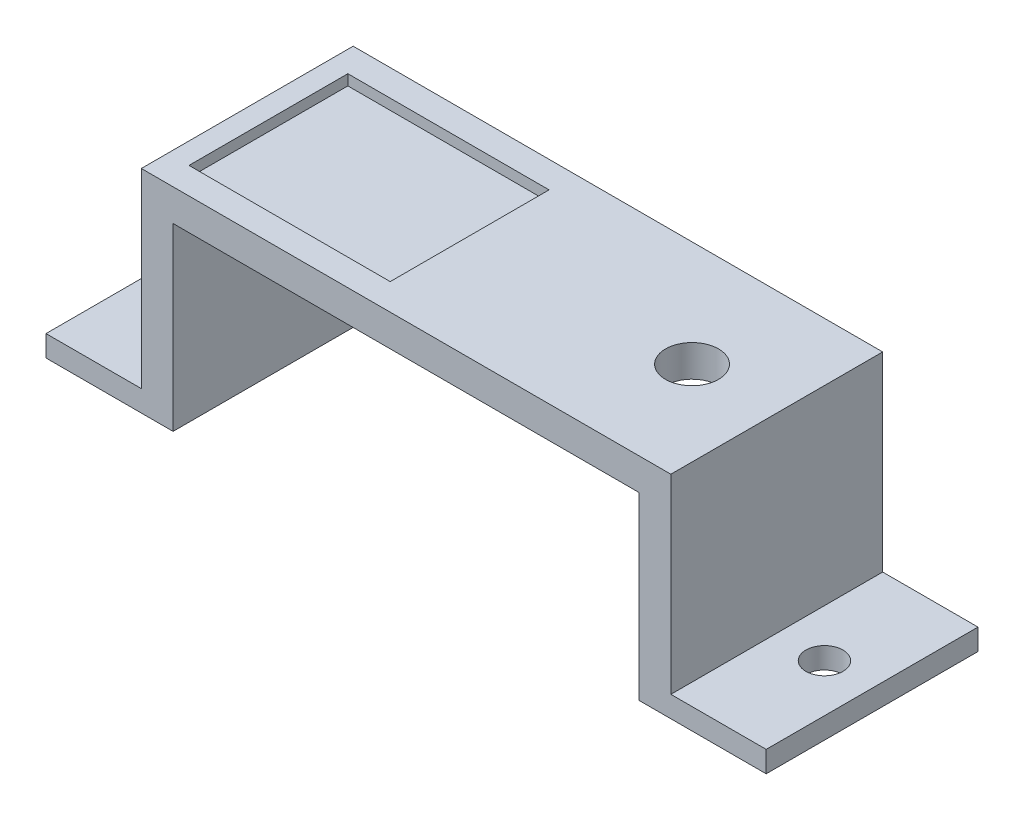
ISO-10303-21;
HEADER;
FILE_DESCRIPTION(('STEP AP214'),'2;1');
FILE_NAME('part.step','',(''),(''),'','','');
FILE_SCHEMA(('AUTOMOTIVE_DESIGN { 1 0 10303 214 1 1 1 1 }'));
ENDSEC;
DATA;
#1=APPLICATION_CONTEXT('core data for automotive mechanical design processes');
#2=APPLICATION_PROTOCOL_DEFINITION('international standard','automotive_design',2000,#1);
#3=PRODUCT_CONTEXT('',#1,'mechanical');
#4=PRODUCT('Part','Part','',(#3));
#5=PRODUCT_RELATED_PRODUCT_CATEGORY('part','',(#4));
#6=PRODUCT_DEFINITION_FORMATION('','',#4);
#7=PRODUCT_DEFINITION_CONTEXT('part definition',#1,'design');
#8=PRODUCT_DEFINITION('design','',#6,#7);
#9=PRODUCT_DEFINITION_SHAPE('','',#8);
#10=(LENGTH_UNIT() NAMED_UNIT(*) SI_UNIT(.MILLI.,.METRE.));
#11=(NAMED_UNIT(*) PLANE_ANGLE_UNIT() SI_UNIT($,.RADIAN.));
#12=(NAMED_UNIT(*) SI_UNIT($,.STERADIAN.) SOLID_ANGLE_UNIT());
#13=UNCERTAINTY_MEASURE_WITH_UNIT(LENGTH_MEASURE(1.E-05),#10,'distance_accuracy_value','');
#14=(GEOMETRIC_REPRESENTATION_CONTEXT(3) GLOBAL_UNCERTAINTY_ASSIGNED_CONTEXT((#13)) GLOBAL_UNIT_ASSIGNED_CONTEXT((#10,
#11,#12)) REPRESENTATION_CONTEXT('',''));
#15=CARTESIAN_POINT('',(0.,0.,0.));
#16=DIRECTION('',(0.,0.,1.));
#17=DIRECTION('',(1.,0.,0.));
#18=AXIS2_PLACEMENT_3D('',#15,#16,#17);
#19=CARTESIAN_POINT('',(-22.,0.,20.));
#20=DIRECTION('',(-1.,0.,0.));
#21=DIRECTION('',(0.,0.,1.));
#22=AXIS2_PLACEMENT_3D('',#19,#20,#21);
#23=PLANE('',#22);
#24=DIRECTION('',(0.,1.,0.));
#25=VECTOR('',#24,1.);
#26=CARTESIAN_POINT('',(-22.,0.,0.));
#27=LINE('',#26,#25);
#28=CARTESIAN_POINT('',(-22.,0.,0.));
#29=VERTEX_POINT('',#28);
#30=CARTESIAN_POINT('',(-22.,17.,0.));
#31=VERTEX_POINT('',#30);
#32=EDGE_CURVE('E228',#29,#31,#27,.T.);
#33=ORIENTED_EDGE('',*,*,#32,.T.);
#34=DIRECTION('',(0.,0.,-1.));
#35=VECTOR('',#34,1.);
#36=CARTESIAN_POINT('',(-22.,17.,20.));
#37=LINE('',#36,#35);
#38=CARTESIAN_POINT('',(-22.,17.,20.));
#39=VERTEX_POINT('',#38);
#40=EDGE_CURVE('E11',#39,#31,#37,.T.);
#41=ORIENTED_EDGE('',*,*,#40,.F.);
#42=DIRECTION('',(0.,1.,0.));
#43=VECTOR('',#42,1.);
#44=CARTESIAN_POINT('',(-22.,0.,20.));
#45=LINE('',#44,#43);
#46=CARTESIAN_POINT('',(-22.,0.,20.));
#47=VERTEX_POINT('',#46);
#48=EDGE_CURVE('E235',#47,#39,#45,.T.);
#49=ORIENTED_EDGE('',*,*,#48,.F.);
#50=DIRECTION('',(0.,0.,-1.));
#51=VECTOR('',#50,1.);
#52=CARTESIAN_POINT('',(-22.,0.,20.));
#53=LINE('',#52,#51);
#54=EDGE_CURVE('E254',#47,#29,#53,.T.);
#55=ORIENTED_EDGE('',*,*,#54,.T.);
#56=EDGE_LOOP('',(#33,#41,#49,#55));
#57=FACE_BOUND('',#56,.T.);
#58=ADVANCED_FACE('F33',(#57),#23,.F.);
#59=CARTESIAN_POINT('',(22.,17.,20.));
#60=DIRECTION('',(0.,1.,0.));
#61=DIRECTION('',(-1.,0.,0.));
#62=AXIS2_PLACEMENT_3D('',#59,#60,#61);
#63=PLANE('',#62);
#64=CARTESIAN_POINT('',(17.,17.,10.));
#65=DIRECTION('',(0.,1.,0.));
#66=DIRECTION('',(-1.,0.,0.));
#67=AXIS2_PLACEMENT_3D('',#64,#65,#66);
#68=CIRCLE('',#67,2.5);
#69=CARTESIAN_POINT('',(14.5,17.,10.));
#70=VERTEX_POINT('',#69);
#71=EDGE_CURVE('E199',#70,#70,#68,.T.);
#72=ORIENTED_EDGE('',*,*,#71,.T.);
#73=EDGE_LOOP('',(#72));
#74=FACE_BOUND('',#73,.T.);
#75=DIRECTION('',(1.,0.,0.));
#76=VECTOR('',#75,1.);
#77=CARTESIAN_POINT('',(22.,17.,0.));
#78=LINE('',#77,#76);
#79=CARTESIAN_POINT('',(22.,17.,0.));
#80=VERTEX_POINT('',#79);
#81=EDGE_CURVE('E257',#31,#80,#78,.T.);
#82=ORIENTED_EDGE('',*,*,#81,.T.);
#83=DIRECTION('',(0.,0.,-1.));
#84=VECTOR('',#83,1.);
#85=CARTESIAN_POINT('',(22.,17.,20.));
#86=LINE('',#85,#84);
#87=CARTESIAN_POINT('',(22.,17.,20.));
#88=VERTEX_POINT('',#87);
#89=EDGE_CURVE('E41',#88,#80,#86,.T.);
#90=ORIENTED_EDGE('',*,*,#89,.F.);
#91=DIRECTION('',(1.,0.,0.));
#92=VECTOR('',#91,1.);
#93=CARTESIAN_POINT('',(22.,17.,20.));
#94=LINE('',#93,#92);
#95=EDGE_CURVE('E238',#39,#88,#94,.T.);
#96=ORIENTED_EDGE('',*,*,#95,.F.);
#97=ORIENTED_EDGE('',*,*,#40,.T.);
#98=EDGE_LOOP('',(#82,#90,#96,#97));
#99=FACE_BOUND('',#98,.T.);
#100=ADVANCED_FACE('F312',(#74,#99),#63,.F.);
#101=CARTESIAN_POINT('',(22.,0.,20.));
#102=DIRECTION('',(1.,0.,0.));
#103=DIRECTION('',(0.,0.,-1.));
#104=AXIS2_PLACEMENT_3D('',#101,#102,#103);
#105=PLANE('',#104);
#106=DIRECTION('',(0.,-1.,0.));
#107=VECTOR('',#106,1.);
#108=CARTESIAN_POINT('',(22.,0.,0.));
#109=LINE('',#108,#107);
#110=CARTESIAN_POINT('',(22.,0.,0.));
#111=VERTEX_POINT('',#110);
#112=EDGE_CURVE('E259',#80,#111,#109,.T.);
#113=ORIENTED_EDGE('',*,*,#112,.T.);
#114=DIRECTION('',(0.,0.,-1.));
#115=VECTOR('',#114,1.);
#116=CARTESIAN_POINT('',(22.,0.,20.));
#117=LINE('',#116,#115);
#118=CARTESIAN_POINT('',(22.,0.,20.));
#119=VERTEX_POINT('',#118);
#120=EDGE_CURVE('E278',#119,#111,#117,.T.);
#121=ORIENTED_EDGE('',*,*,#120,.F.);
#122=DIRECTION('',(0.,-1.,0.));
#123=VECTOR('',#122,1.);
#124=CARTESIAN_POINT('',(22.,0.,20.));
#125=LINE('',#124,#123);
#126=EDGE_CURVE('E241',#88,#119,#125,.T.);
#127=ORIENTED_EDGE('',*,*,#126,.F.);
#128=ORIENTED_EDGE('',*,*,#89,.T.);
#129=EDGE_LOOP('',(#113,#121,#127,#128));
#130=FACE_BOUND('',#129,.T.);
#131=ADVANCED_FACE('F303',(#130),#105,.F.);
#132=CARTESIAN_POINT('',(22.,0.,20.));
#133=DIRECTION('',(0.,1.,0.));
#134=DIRECTION('',(-1.,0.,0.));
#135=AXIS2_PLACEMENT_3D('',#132,#133,#134);
#136=PLANE('',#135);
#137=CARTESIAN_POINT('',(29.5,0.,10.));
#138=DIRECTION('',(0.,-1.,0.));
#139=DIRECTION('',(1.,0.,0.));
#140=AXIS2_PLACEMENT_3D('',#137,#138,#139);
#141=CIRCLE('',#140,1.75);
#142=CARTESIAN_POINT('',(31.25,0.,10.));
#143=VERTEX_POINT('',#142);
#144=EDGE_CURVE('E289',#143,#143,#141,.T.);
#145=ORIENTED_EDGE('',*,*,#144,.F.);
#146=EDGE_LOOP('',(#145));
#147=FACE_BOUND('',#146,.T.);
#148=DIRECTION('',(1.,0.,0.));
#149=VECTOR('',#148,1.);
#150=CARTESIAN_POINT('',(22.,0.,0.));
#151=LINE('',#150,#149);
#152=CARTESIAN_POINT('',(34.,0.,0.));
#153=VERTEX_POINT('',#152);
#154=EDGE_CURVE('E261',#111,#153,#151,.T.);
#155=ORIENTED_EDGE('',*,*,#154,.T.);
#156=DIRECTION('',(0.,0.,1.));
#157=VECTOR('',#156,1.);
#158=CARTESIAN_POINT('',(34.,0.,0.));
#159=LINE('',#158,#157);
#160=CARTESIAN_POINT('',(34.,0.,20.));
#161=VERTEX_POINT('',#160);
#162=EDGE_CURVE('E156',#153,#161,#159,.T.);
#163=ORIENTED_EDGE('',*,*,#162,.T.);
#164=DIRECTION('',(1.,0.,0.));
#165=VECTOR('',#164,1.);
#166=CARTESIAN_POINT('',(22.,0.,20.));
#167=LINE('',#166,#165);
#168=EDGE_CURVE('E243',#119,#161,#167,.T.);
#169=ORIENTED_EDGE('',*,*,#168,.F.);
#170=ORIENTED_EDGE('',*,*,#120,.T.);
#171=EDGE_LOOP('',(#155,#163,#169,#170));
#172=FACE_BOUND('',#171,.T.);
#173=ADVANCED_FACE('F299',(#147,#172),#136,.F.);
#174=CARTESIAN_POINT('',(25.,0.,20.));
#175=DIRECTION('',(-1.,0.,0.));
#176=DIRECTION('',(0.,-1.,0.));
#177=AXIS2_PLACEMENT_3D('',#174,#175,#176);
#178=PLANE('',#177);
#179=DIRECTION('',(0.,1.,0.));
#180=VECTOR('',#179,1.);
#181=CARTESIAN_POINT('',(25.,0.,20.));
#182=LINE('',#181,#180);
#183=CARTESIAN_POINT('',(25.,2.,20.));
#184=VERTEX_POINT('',#183);
#185=CARTESIAN_POINT('',(25.,20.,20.));
#186=VERTEX_POINT('',#185);
#187=EDGE_CURVE('E245',#184,#186,#182,.T.);
#188=ORIENTED_EDGE('',*,*,#187,.F.);
#189=DIRECTION('',(0.,0.,-1.));
#190=VECTOR('',#189,1.);
#191=CARTESIAN_POINT('',(25.,2.,0.));
#192=LINE('',#191,#190);
#193=CARTESIAN_POINT('',(25.,2.,0.));
#194=VERTEX_POINT('',#193);
#195=EDGE_CURVE('E170',#184,#194,#192,.T.);
#196=ORIENTED_EDGE('',*,*,#195,.T.);
#197=DIRECTION('',(0.,1.,0.));
#198=VECTOR('',#197,1.);
#199=CARTESIAN_POINT('',(25.,0.,0.));
#200=LINE('',#199,#198);
#201=CARTESIAN_POINT('',(25.,20.,0.));
#202=VERTEX_POINT('',#201);
#203=EDGE_CURVE('E169',#194,#202,#200,.T.);
#204=ORIENTED_EDGE('',*,*,#203,.T.);
#205=DIRECTION('',(0.,0.,-1.));
#206=VECTOR('',#205,1.);
#207=CARTESIAN_POINT('',(25.,20.,20.));
#208=LINE('',#207,#206);
#209=EDGE_CURVE('E275',#186,#202,#208,.T.);
#210=ORIENTED_EDGE('',*,*,#209,.F.);
#211=EDGE_LOOP('',(#188,#196,#204,#210));
#212=FACE_BOUND('',#211,.T.);
#213=ADVANCED_FACE('F302',(#212),#178,.F.);
#214=CARTESIAN_POINT('',(25.,20.,20.));
#215=DIRECTION('',(0.,-1.,0.));
#216=DIRECTION('',(1.,0.,0.));
#217=AXIS2_PLACEMENT_3D('',#214,#215,#216);
#218=PLANE('',#217);
#219=CARTESIAN_POINT('',(17.,20.,10.));
#220=DIRECTION('',(0.,1.,0.));
#221=DIRECTION('',(-1.,0.,0.));
#222=AXIS2_PLACEMENT_3D('',#219,#220,#221);
#223=CIRCLE('',#222,2.5);
#224=CARTESIAN_POINT('',(14.5,20.,10.));
#225=VERTEX_POINT('',#224);
#226=EDGE_CURVE('E194',#225,#225,#223,.T.);
#227=ORIENTED_EDGE('',*,*,#226,.F.);
#228=EDGE_LOOP('',(#227));
#229=FACE_BOUND('',#228,.T.);
#230=DIRECTION('',(-1.,0.,0.));
#231=VECTOR('',#230,1.);
#232=CARTESIAN_POINT('',(-23.,20.,2.5));
#233=LINE('',#232,#231);
#234=CARTESIAN_POINT('',(-4.,20.,2.5));
#235=VERTEX_POINT('',#234);
#236=CARTESIAN_POINT('',(-23.,20.,2.5));
#237=VERTEX_POINT('',#236);
#238=EDGE_CURVE('E218',#235,#237,#233,.T.);
#239=ORIENTED_EDGE('',*,*,#238,.F.);
#240=DIRECTION('',(0.,0.,-1.));
#241=VECTOR('',#240,1.);
#242=CARTESIAN_POINT('',(-4.,20.,17.5));
#243=LINE('',#242,#241);
#244=CARTESIAN_POINT('',(-4.,20.,17.5));
#245=VERTEX_POINT('',#244);
#246=EDGE_CURVE('E202',#245,#235,#243,.T.);
#247=ORIENTED_EDGE('',*,*,#246,.F.);
#248=DIRECTION('',(1.,0.,0.));
#249=VECTOR('',#248,1.);
#250=CARTESIAN_POINT('',(-23.,20.,17.5));
#251=LINE('',#250,#249);
#252=CARTESIAN_POINT('',(-23.,20.,17.5));
#253=VERTEX_POINT('',#252);
#254=EDGE_CURVE('E207',#253,#245,#251,.T.);
#255=ORIENTED_EDGE('',*,*,#254,.F.);
#256=DIRECTION('',(0.,0.,1.));
#257=VECTOR('',#256,1.);
#258=CARTESIAN_POINT('',(-23.,20.,17.5));
#259=LINE('',#258,#257);
#260=EDGE_CURVE('E221',#237,#253,#259,.T.);
#261=ORIENTED_EDGE('',*,*,#260,.F.);
#262=EDGE_LOOP('',(#239,#247,#255,#261));
#263=FACE_BOUND('',#262,.T.);
#264=DIRECTION('',(-1.,0.,0.));
#265=VECTOR('',#264,1.);
#266=CARTESIAN_POINT('',(25.,20.,0.));
#267=LINE('',#266,#265);
#268=CARTESIAN_POINT('',(-25.,20.,0.));
#269=VERTEX_POINT('',#268);
#270=EDGE_CURVE('E264',#202,#269,#267,.T.);
#271=ORIENTED_EDGE('',*,*,#270,.T.);
#272=DIRECTION('',(0.,0.,-1.));
#273=VECTOR('',#272,1.);
#274=CARTESIAN_POINT('',(-25.,20.,20.));
#275=LINE('',#274,#273);
#276=CARTESIAN_POINT('',(-25.,20.,20.));
#277=VERTEX_POINT('',#276);
#278=EDGE_CURVE('E272',#277,#269,#275,.T.);
#279=ORIENTED_EDGE('',*,*,#278,.F.);
#280=DIRECTION('',(-1.,0.,0.));
#281=VECTOR('',#280,1.);
#282=CARTESIAN_POINT('',(25.,20.,20.));
#283=LINE('',#282,#281);
#284=EDGE_CURVE('E247',#186,#277,#283,.T.);
#285=ORIENTED_EDGE('',*,*,#284,.F.);
#286=ORIENTED_EDGE('',*,*,#209,.T.);
#287=EDGE_LOOP('',(#271,#279,#285,#286));
#288=FACE_BOUND('',#287,.T.);
#289=ADVANCED_FACE('F333',(#229,#263,#288),#218,.F.);
#290=CARTESIAN_POINT('',(-25.,0.,20.));
#291=DIRECTION('',(1.,0.,0.));
#292=DIRECTION('',(0.,0.,-1.));
#293=AXIS2_PLACEMENT_3D('',#290,#291,#292);
#294=PLANE('',#293);
#295=DIRECTION('',(0.,-1.,0.));
#296=VECTOR('',#295,1.);
#297=CARTESIAN_POINT('',(-25.,0.,0.));
#298=LINE('',#297,#296);
#299=CARTESIAN_POINT('',(-25.,2.,0.));
#300=VERTEX_POINT('',#299);
#301=EDGE_CURVE('E266',#269,#300,#298,.T.);
#302=ORIENTED_EDGE('',*,*,#301,.T.);
#303=DIRECTION('',(0.,0.,1.));
#304=VECTOR('',#303,1.);
#305=CARTESIAN_POINT('',(-25.,2.,0.));
#306=LINE('',#305,#304);
#307=CARTESIAN_POINT('',(-25.,2.,20.));
#308=VERTEX_POINT('',#307);
#309=EDGE_CURVE('E179',#300,#308,#306,.T.);
#310=ORIENTED_EDGE('',*,*,#309,.T.);
#311=DIRECTION('',(0.,-1.,0.));
#312=VECTOR('',#311,1.);
#313=CARTESIAN_POINT('',(-25.,0.,20.));
#314=LINE('',#313,#312);
#315=EDGE_CURVE('E249',#277,#308,#314,.T.);
#316=ORIENTED_EDGE('',*,*,#315,.F.);
#317=ORIENTED_EDGE('',*,*,#278,.T.);
#318=EDGE_LOOP('',(#302,#310,#316,#317));
#319=FACE_BOUND('',#318,.T.);
#320=ADVANCED_FACE('F328',(#319),#294,.F.);
#321=CARTESIAN_POINT('',(-25.,0.,20.));
#322=DIRECTION('',(0.,1.,0.));
#323=DIRECTION('',(-1.,0.,0.));
#324=AXIS2_PLACEMENT_3D('',#321,#322,#323);
#325=PLANE('',#324);
#326=CARTESIAN_POINT('',(-29.5,0.,10.));
#327=DIRECTION('',(0.,-1.,0.));
#328=DIRECTION('',(1.,0.,0.));
#329=AXIS2_PLACEMENT_3D('',#326,#327,#328);
#330=CIRCLE('',#329,1.75);
#331=CARTESIAN_POINT('',(-27.75,0.,10.));
#332=VERTEX_POINT('',#331);
#333=EDGE_CURVE('E284',#332,#332,#330,.T.);
#334=ORIENTED_EDGE('',*,*,#333,.F.);
#335=EDGE_LOOP('',(#334));
#336=FACE_BOUND('',#335,.T.);
#337=DIRECTION('',(1.,0.,0.));
#338=VECTOR('',#337,1.);
#339=CARTESIAN_POINT('',(-25.,0.,0.));
#340=LINE('',#339,#338);
#341=CARTESIAN_POINT('',(-34.,0.,0.));
#342=VERTEX_POINT('',#341);
#343=EDGE_CURVE('E239',#342,#29,#340,.T.);
#344=ORIENTED_EDGE('',*,*,#343,.T.);
#345=ORIENTED_EDGE('',*,*,#54,.F.);
#346=DIRECTION('',(1.,0.,0.));
#347=VECTOR('',#346,1.);
#348=CARTESIAN_POINT('',(-25.,0.,20.));
#349=LINE('',#348,#347);
#350=CARTESIAN_POINT('',(-34.,0.,20.));
#351=VERTEX_POINT('',#350);
#352=EDGE_CURVE('E252',#351,#47,#349,.T.);
#353=ORIENTED_EDGE('',*,*,#352,.F.);
#354=DIRECTION('',(0.,0.,-1.));
#355=VECTOR('',#354,1.);
#356=CARTESIAN_POINT('',(-34.,0.,0.));
#357=LINE('',#356,#355);
#358=EDGE_CURVE('E177',#351,#342,#357,.T.);
#359=ORIENTED_EDGE('',*,*,#358,.T.);
#360=EDGE_LOOP('',(#344,#345,#353,#359));
#361=FACE_BOUND('',#360,.T.);
#362=ADVANCED_FACE('F322',(#336,#361),#325,.F.);
#363=CARTESIAN_POINT('',(0.,0.,20.));
#364=DIRECTION('',(0.,0.,1.));
#365=DIRECTION('',(1.,0.,0.));
#366=AXIS2_PLACEMENT_3D('',#363,#364,#365);
#367=PLANE('',#366);
#368=ORIENTED_EDGE('',*,*,#48,.T.);
#369=ORIENTED_EDGE('',*,*,#95,.T.);
#370=ORIENTED_EDGE('',*,*,#126,.T.);
#371=ORIENTED_EDGE('',*,*,#168,.T.);
#372=DIRECTION('',(0.,-1.,0.));
#373=VECTOR('',#372,1.);
#374=CARTESIAN_POINT('',(34.,2.,20.));
#375=LINE('',#374,#373);
#376=CARTESIAN_POINT('',(34.,2.,20.));
#377=VERTEX_POINT('',#376);
#378=EDGE_CURVE('E159',#377,#161,#375,.T.);
#379=ORIENTED_EDGE('',*,*,#378,.F.);
#380=DIRECTION('',(-1.,0.,0.));
#381=VECTOR('',#380,1.);
#382=CARTESIAN_POINT('',(34.,2.,20.));
#383=LINE('',#382,#381);
#384=EDGE_CURVE('E160',#377,#184,#383,.T.);
#385=ORIENTED_EDGE('',*,*,#384,.T.);
#386=ORIENTED_EDGE('',*,*,#187,.T.);
#387=ORIENTED_EDGE('',*,*,#284,.T.);
#388=ORIENTED_EDGE('',*,*,#315,.T.);
#389=DIRECTION('',(-1.,0.,0.));
#390=VECTOR('',#389,1.);
#391=CARTESIAN_POINT('',(-34.,2.,20.));
#392=LINE('',#391,#390);
#393=CARTESIAN_POINT('',(-34.,2.,20.));
#394=VERTEX_POINT('',#393);
#395=EDGE_CURVE('E57',#308,#394,#392,.T.);
#396=ORIENTED_EDGE('',*,*,#395,.T.);
#397=DIRECTION('',(0.,-1.,0.));
#398=VECTOR('',#397,1.);
#399=CARTESIAN_POINT('',(-34.,2.,20.));
#400=LINE('',#399,#398);
#401=EDGE_CURVE('E188',#394,#351,#400,.T.);
#402=ORIENTED_EDGE('',*,*,#401,.T.);
#403=ORIENTED_EDGE('',*,*,#352,.T.);
#404=EDGE_LOOP('',(#368,#369,#370,#371,#379,#385,#386,#387,#388,#396,#402,#403));
#405=FACE_BOUND('',#404,.T.);
#406=ADVANCED_FACE('F324',(#405),#367,.T.);
#407=CARTESIAN_POINT('',(0.,0.,0.));
#408=DIRECTION('',(0.,0.,1.));
#409=DIRECTION('',(1.,0.,0.));
#410=AXIS2_PLACEMENT_3D('',#407,#408,#409);
#411=PLANE('',#410);
#412=ORIENTED_EDGE('',*,*,#32,.F.);
#413=ORIENTED_EDGE('',*,*,#343,.F.);
#414=DIRECTION('',(0.,-1.,0.));
#415=VECTOR('',#414,1.);
#416=CARTESIAN_POINT('',(-34.,2.,0.));
#417=LINE('',#416,#415);
#418=CARTESIAN_POINT('',(-34.,2.,0.));
#419=VERTEX_POINT('',#418);
#420=EDGE_CURVE('E191',#419,#342,#417,.T.);
#421=ORIENTED_EDGE('',*,*,#420,.F.);
#422=DIRECTION('',(1.,0.,0.));
#423=VECTOR('',#422,1.);
#424=CARTESIAN_POINT('',(-34.,2.,0.));
#425=LINE('',#424,#423);
#426=EDGE_CURVE('E185',#419,#300,#425,.T.);
#427=ORIENTED_EDGE('',*,*,#426,.T.);
#428=ORIENTED_EDGE('',*,*,#301,.F.);
#429=ORIENTED_EDGE('',*,*,#270,.F.);
#430=ORIENTED_EDGE('',*,*,#203,.F.);
#431=DIRECTION('',(1.,0.,0.));
#432=VECTOR('',#431,1.);
#433=CARTESIAN_POINT('',(34.,2.,0.));
#434=LINE('',#433,#432);
#435=CARTESIAN_POINT('',(34.,2.,0.));
#436=VERTEX_POINT('',#435);
#437=EDGE_CURVE('E49',#194,#436,#434,.T.);
#438=ORIENTED_EDGE('',*,*,#437,.T.);
#439=DIRECTION('',(0.,-1.,0.));
#440=VECTOR('',#439,1.);
#441=CARTESIAN_POINT('',(34.,2.,0.));
#442=LINE('',#441,#440);
#443=EDGE_CURVE('E150',#436,#153,#442,.T.);
#444=ORIENTED_EDGE('',*,*,#443,.T.);
#445=ORIENTED_EDGE('',*,*,#154,.F.);
#446=ORIENTED_EDGE('',*,*,#112,.F.);
#447=ORIENTED_EDGE('',*,*,#81,.F.);
#448=EDGE_LOOP('',(#412,#413,#421,#427,#428,#429,#430,#438,#444,#445,#446,#447));
#449=FACE_BOUND('',#448,.T.);
#450=ADVANCED_FACE('F167',(#449),#411,.F.);
#451=CARTESIAN_POINT('',(-4.,19.,17.5));
#452=DIRECTION('',(1.,0.,0.));
#453=DIRECTION('',(0.,1.,0.));
#454=AXIS2_PLACEMENT_3D('',#451,#452,#453);
#455=PLANE('',#454);
#456=ORIENTED_EDGE('',*,*,#246,.T.);
#457=DIRECTION('',(0.,1.,0.));
#458=VECTOR('',#457,1.);
#459=CARTESIAN_POINT('',(-4.,19.,2.5));
#460=LINE('',#459,#458);
#461=CARTESIAN_POINT('',(-4.,19.,2.5));
#462=VERTEX_POINT('',#461);
#463=EDGE_CURVE('E216',#462,#235,#460,.T.);
#464=ORIENTED_EDGE('',*,*,#463,.F.);
#465=DIRECTION('',(0.,0.,-1.));
#466=VECTOR('',#465,1.);
#467=CARTESIAN_POINT('',(-4.,19.,17.5));
#468=LINE('',#467,#466);
#469=CARTESIAN_POINT('',(-4.,19.,17.5));
#470=VERTEX_POINT('',#469);
#471=EDGE_CURVE('E203',#470,#462,#468,.T.);
#472=ORIENTED_EDGE('',*,*,#471,.F.);
#473=DIRECTION('',(0.,1.,0.));
#474=VECTOR('',#473,1.);
#475=CARTESIAN_POINT('',(-4.,19.,17.5));
#476=LINE('',#475,#474);
#477=EDGE_CURVE('E226',#470,#245,#476,.T.);
#478=ORIENTED_EDGE('',*,*,#477,.T.);
#479=EDGE_LOOP('',(#456,#464,#472,#478));
#480=FACE_BOUND('',#479,.T.);
#481=ADVANCED_FACE('F375',(#480),#455,.F.);
#482=CARTESIAN_POINT('',(-23.,19.,17.5));
#483=DIRECTION('',(0.,0.,1.));
#484=DIRECTION('',(1.,0.,0.));
#485=AXIS2_PLACEMENT_3D('',#482,#483,#484);
#486=PLANE('',#485);
#487=ORIENTED_EDGE('',*,*,#254,.T.);
#488=ORIENTED_EDGE('',*,*,#477,.F.);
#489=DIRECTION('',(1.,0.,0.));
#490=VECTOR('',#489,1.);
#491=CARTESIAN_POINT('',(-23.,19.,17.5));
#492=LINE('',#491,#490);
#493=CARTESIAN_POINT('',(-23.,19.,17.5));
#494=VERTEX_POINT('',#493);
#495=EDGE_CURVE('E213',#494,#470,#492,.T.);
#496=ORIENTED_EDGE('',*,*,#495,.F.);
#497=DIRECTION('',(0.,1.,0.));
#498=VECTOR('',#497,1.);
#499=CARTESIAN_POINT('',(-23.,19.,17.5));
#500=LINE('',#499,#498);
#501=EDGE_CURVE('E229',#494,#253,#500,.T.);
#502=ORIENTED_EDGE('',*,*,#501,.T.);
#503=EDGE_LOOP('',(#487,#488,#496,#502));
#504=FACE_BOUND('',#503,.T.);
#505=ADVANCED_FACE('F371',(#504),#486,.F.);
#506=CARTESIAN_POINT('',(-23.,19.,17.5));
#507=DIRECTION('',(-1.,0.,0.));
#508=DIRECTION('',(0.,-1.,0.));
#509=AXIS2_PLACEMENT_3D('',#506,#507,#508);
#510=PLANE('',#509);
#511=ORIENTED_EDGE('',*,*,#260,.T.);
#512=ORIENTED_EDGE('',*,*,#501,.F.);
#513=DIRECTION('',(0.,0.,1.));
#514=VECTOR('',#513,1.);
#515=CARTESIAN_POINT('',(-23.,19.,17.5));
#516=LINE('',#515,#514);
#517=CARTESIAN_POINT('',(-23.,19.,2.5));
#518=VERTEX_POINT('',#517);
#519=EDGE_CURVE('E210',#518,#494,#516,.T.);
#520=ORIENTED_EDGE('',*,*,#519,.F.);
#521=DIRECTION('',(0.,1.,0.));
#522=VECTOR('',#521,1.);
#523=CARTESIAN_POINT('',(-23.,19.,2.5));
#524=LINE('',#523,#522);
#525=EDGE_CURVE('E231',#518,#237,#524,.T.);
#526=ORIENTED_EDGE('',*,*,#525,.T.);
#527=EDGE_LOOP('',(#511,#512,#520,#526));
#528=FACE_BOUND('',#527,.T.);
#529=ADVANCED_FACE('F374',(#528),#510,.F.);
#530=CARTESIAN_POINT('',(-23.,19.,2.5));
#531=DIRECTION('',(0.,0.,-1.));
#532=DIRECTION('',(-1.,0.,0.));
#533=AXIS2_PLACEMENT_3D('',#530,#531,#532);
#534=PLANE('',#533);
#535=ORIENTED_EDGE('',*,*,#238,.T.);
#536=ORIENTED_EDGE('',*,*,#525,.F.);
#537=DIRECTION('',(-1.,0.,0.));
#538=VECTOR('',#537,1.);
#539=CARTESIAN_POINT('',(-23.,19.,2.5));
#540=LINE('',#539,#538);
#541=EDGE_CURVE('E206',#462,#518,#540,.T.);
#542=ORIENTED_EDGE('',*,*,#541,.F.);
#543=ORIENTED_EDGE('',*,*,#463,.T.);
#544=EDGE_LOOP('',(#535,#536,#542,#543));
#545=FACE_BOUND('',#544,.T.);
#546=ADVANCED_FACE('F366',(#545),#534,.F.);
#547=CARTESIAN_POINT('',(0.,19.,0.));
#548=DIRECTION('',(0.,-1.,0.));
#549=DIRECTION('',(1.,0.,0.));
#550=AXIS2_PLACEMENT_3D('',#547,#548,#549);
#551=PLANE('',#550);
#552=ORIENTED_EDGE('',*,*,#471,.T.);
#553=ORIENTED_EDGE('',*,*,#541,.T.);
#554=ORIENTED_EDGE('',*,*,#519,.T.);
#555=ORIENTED_EDGE('',*,*,#495,.T.);
#556=EDGE_LOOP('',(#552,#553,#554,#555));
#557=FACE_BOUND('',#556,.T.);
#558=ADVANCED_FACE('F359',(#557),#551,.F.);
#559=CARTESIAN_POINT('',(17.,0.,10.));
#560=DIRECTION('',(0.,1.,0.));
#561=DIRECTION('',(-1.,0.,0.));
#562=AXIS2_PLACEMENT_3D('',#559,#560,#561);
#563=CYLINDRICAL_SURFACE('',#562,2.5);
#564=ORIENTED_EDGE('',*,*,#226,.T.);
#565=EDGE_LOOP('',(#564));
#566=FACE_BOUND('',#565,.T.);
#567=ORIENTED_EDGE('',*,*,#71,.F.);
#568=EDGE_LOOP('',(#567));
#569=FACE_BOUND('',#568,.T.);
#570=ADVANCED_FACE('F357',(#566,#569),#563,.F.);
#571=CARTESIAN_POINT('',(-34.,2.,0.));
#572=DIRECTION('',(-1.,0.,0.));
#573=DIRECTION('',(0.,-1.,0.));
#574=AXIS2_PLACEMENT_3D('',#571,#572,#573);
#575=PLANE('',#574);
#576=ORIENTED_EDGE('',*,*,#358,.F.);
#577=ORIENTED_EDGE('',*,*,#401,.F.);
#578=DIRECTION('',(0.,0.,-1.));
#579=VECTOR('',#578,1.);
#580=CARTESIAN_POINT('',(-34.,2.,0.));
#581=LINE('',#580,#579);
#582=EDGE_CURVE('E182',#394,#419,#581,.T.);
#583=ORIENTED_EDGE('',*,*,#582,.T.);
#584=ORIENTED_EDGE('',*,*,#420,.T.);
#585=EDGE_LOOP('',(#576,#577,#583,#584));
#586=FACE_BOUND('',#585,.T.);
#587=ADVANCED_FACE('F320',(#586),#575,.T.);
#588=CARTESIAN_POINT('',(0.,2.,0.));
#589=DIRECTION('',(0.,1.,0.));
#590=DIRECTION('',(-1.,0.,0.));
#591=AXIS2_PLACEMENT_3D('',#588,#589,#590);
#592=PLANE('',#591);
#593=CARTESIAN_POINT('',(-29.5,2.,10.));
#594=DIRECTION('',(0.,1.,0.));
#595=DIRECTION('',(-1.,0.,0.));
#596=AXIS2_PLACEMENT_3D('',#593,#594,#595);
#597=CIRCLE('',#596,1.75);
#598=CARTESIAN_POINT('',(-31.25,2.,10.));
#599=VERTEX_POINT('',#598);
#600=EDGE_CURVE('E36',#599,#599,#597,.T.);
#601=ORIENTED_EDGE('',*,*,#600,.F.);
#602=EDGE_LOOP('',(#601));
#603=FACE_BOUND('',#602,.T.);
#604=ORIENTED_EDGE('',*,*,#309,.F.);
#605=ORIENTED_EDGE('',*,*,#426,.F.);
#606=ORIENTED_EDGE('',*,*,#582,.F.);
#607=ORIENTED_EDGE('',*,*,#395,.F.);
#608=EDGE_LOOP('',(#604,#605,#606,#607));
#609=FACE_BOUND('',#608,.T.);
#610=ADVANCED_FACE('F325',(#603,#609),#592,.T.);
#611=CARTESIAN_POINT('',(34.,2.,0.));
#612=DIRECTION('',(1.,0.,0.));
#613=DIRECTION('',(0.,1.,0.));
#614=AXIS2_PLACEMENT_3D('',#611,#612,#613);
#615=PLANE('',#614);
#616=ORIENTED_EDGE('',*,*,#162,.F.);
#617=ORIENTED_EDGE('',*,*,#443,.F.);
#618=DIRECTION('',(0.,0.,1.));
#619=VECTOR('',#618,1.);
#620=CARTESIAN_POINT('',(34.,2.,0.));
#621=LINE('',#620,#619);
#622=EDGE_CURVE('E153',#436,#377,#621,.T.);
#623=ORIENTED_EDGE('',*,*,#622,.T.);
#624=ORIENTED_EDGE('',*,*,#378,.T.);
#625=EDGE_LOOP('',(#616,#617,#623,#624));
#626=FACE_BOUND('',#625,.T.);
#627=ADVANCED_FACE('F151',(#626),#615,.T.);
#628=CARTESIAN_POINT('',(0.,2.,0.));
#629=DIRECTION('',(0.,-1.,0.));
#630=DIRECTION('',(1.,0.,0.));
#631=AXIS2_PLACEMENT_3D('',#628,#629,#630);
#632=PLANE('',#631);
#633=CARTESIAN_POINT('',(29.5,2.,10.));
#634=DIRECTION('',(0.,-1.,0.));
#635=DIRECTION('',(1.,0.,0.));
#636=AXIS2_PLACEMENT_3D('',#633,#634,#635);
#637=CIRCLE('',#636,1.75);
#638=CARTESIAN_POINT('',(31.25,2.,10.));
#639=VERTEX_POINT('',#638);
#640=EDGE_CURVE('E282',#639,#639,#637,.T.);
#641=ORIENTED_EDGE('',*,*,#640,.T.);
#642=EDGE_LOOP('',(#641));
#643=FACE_BOUND('',#642,.T.);
#644=ORIENTED_EDGE('',*,*,#195,.F.);
#645=ORIENTED_EDGE('',*,*,#384,.F.);
#646=ORIENTED_EDGE('',*,*,#622,.F.);
#647=ORIENTED_EDGE('',*,*,#437,.F.);
#648=EDGE_LOOP('',(#644,#645,#646,#647));
#649=FACE_BOUND('',#648,.T.);
#650=ADVANCED_FACE('F162',(#643,#649),#632,.F.);
#651=CARTESIAN_POINT('',(29.5,20.,10.));
#652=DIRECTION('',(0.,-1.,0.));
#653=DIRECTION('',(1.,0.,0.));
#654=AXIS2_PLACEMENT_3D('',#651,#652,#653);
#655=CYLINDRICAL_SURFACE('',#654,1.75);
#656=ORIENTED_EDGE('',*,*,#144,.T.);
#657=EDGE_LOOP('',(#656));
#658=FACE_BOUND('',#657,.T.);
#659=ORIENTED_EDGE('',*,*,#640,.F.);
#660=EDGE_LOOP('',(#659));
#661=FACE_BOUND('',#660,.T.);
#662=ADVANCED_FACE('F296',(#658,#661),#655,.F.);
#663=CARTESIAN_POINT('',(-29.5,20.,10.));
#664=DIRECTION('',(0.,-1.,0.));
#665=DIRECTION('',(1.,0.,0.));
#666=AXIS2_PLACEMENT_3D('',#663,#664,#665);
#667=CYLINDRICAL_SURFACE('',#666,1.75);
#668=ORIENTED_EDGE('',*,*,#600,.T.);
#669=EDGE_LOOP('',(#668));
#670=FACE_BOUND('',#669,.T.);
#671=ORIENTED_EDGE('',*,*,#333,.T.);
#672=EDGE_LOOP('',(#671));
#673=FACE_BOUND('',#672,.T.);
#674=ADVANCED_FACE('F461',(#670,#673),#667,.F.);
#675=CLOSED_SHELL('',(#58,#100,#131,#173,#213,#289,#320,#362,#406,#450,#481,#505,#529,#546,#558,
#570,#587,#610,#627,#650,#662,#674));
#676=MANIFOLD_SOLID_BREP('B2',#675);
#677=ADVANCED_BREP_SHAPE_REPRESENTATION('',(#18,#676),#14);
#678=SHAPE_DEFINITION_REPRESENTATION(#9,#677);
ENDSEC;
END-ISO-10303-21;
